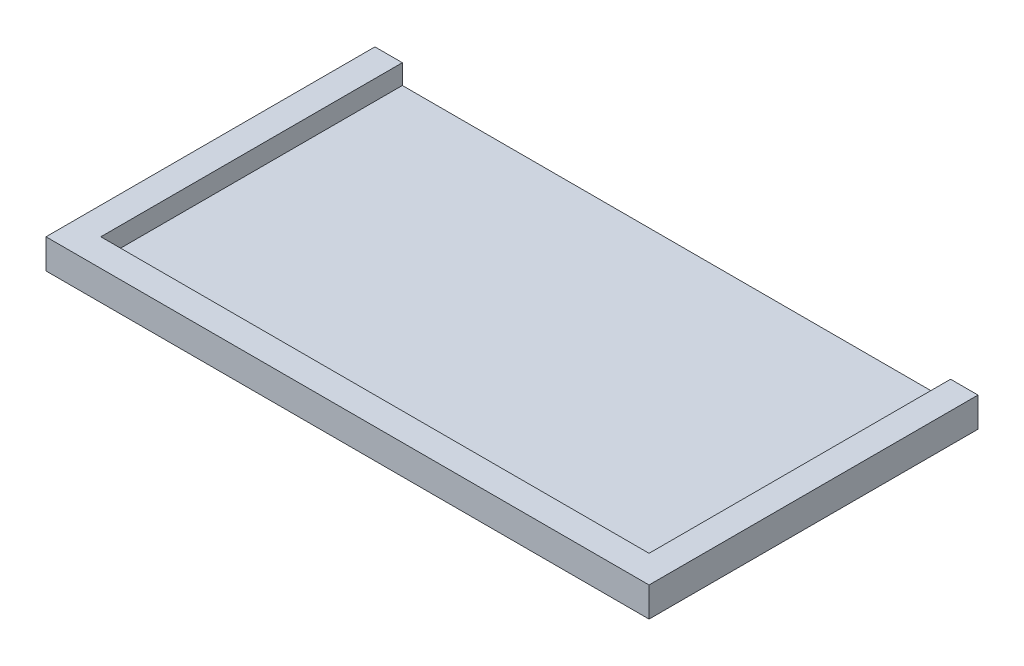
ISO-10303-21;
HEADER;
FILE_DESCRIPTION(('STEP AP214'),'2;1');
FILE_NAME('part.step','',(''),(''),'','','');
FILE_SCHEMA(('AUTOMOTIVE_DESIGN { 1 0 10303 214 1 1 1 1 }'));
ENDSEC;
DATA;
#1=APPLICATION_CONTEXT('core data for automotive mechanical design processes');
#2=APPLICATION_PROTOCOL_DEFINITION('international standard','automotive_design',2000,#1);
#3=PRODUCT_CONTEXT('',#1,'mechanical');
#4=PRODUCT('Part','Part','',(#3));
#5=PRODUCT_RELATED_PRODUCT_CATEGORY('part','',(#4));
#6=PRODUCT_DEFINITION_FORMATION('','',#4);
#7=PRODUCT_DEFINITION_CONTEXT('part definition',#1,'design');
#8=PRODUCT_DEFINITION('design','',#6,#7);
#9=PRODUCT_DEFINITION_SHAPE('','',#8);
#10=(LENGTH_UNIT() NAMED_UNIT(*) SI_UNIT(.MILLI.,.METRE.));
#11=(NAMED_UNIT(*) PLANE_ANGLE_UNIT() SI_UNIT($,.RADIAN.));
#12=(NAMED_UNIT(*) SI_UNIT($,.STERADIAN.) SOLID_ANGLE_UNIT());
#13=UNCERTAINTY_MEASURE_WITH_UNIT(LENGTH_MEASURE(1.E-05),#10,'distance_accuracy_value','');
#14=(GEOMETRIC_REPRESENTATION_CONTEXT(3) GLOBAL_UNCERTAINTY_ASSIGNED_CONTEXT((#13)) GLOBAL_UNIT_ASSIGNED_CONTEXT((#10,
#11,#12)) REPRESENTATION_CONTEXT('',''));
#15=CARTESIAN_POINT('',(0.,0.,0.));
#16=DIRECTION('',(0.,0.,1.));
#17=DIRECTION('',(1.,0.,0.));
#18=AXIS2_PLACEMENT_3D('',#15,#16,#17);
#19=CARTESIAN_POINT('',(0.,0.9,0.));
#20=DIRECTION('',(0.,-1.,0.));
#21=DIRECTION('',(0.,0.,-1.));
#22=AXIS2_PLACEMENT_3D('',#19,#20,#21);
#23=PLANE('',#22);
#24=DIRECTION('',(0.,0.,-1.));
#25=VECTOR('',#24,1.);
#26=CARTESIAN_POINT('',(-25.,0.9,-15.));
#27=LINE('',#26,#25);
#28=CARTESIAN_POINT('',(-25.,0.9,12.5));
#29=VERTEX_POINT('',#28);
#30=CARTESIAN_POINT('',(-25.,0.9,-15.));
#31=VERTEX_POINT('',#30);
#32=EDGE_CURVE('E48',#29,#31,#27,.T.);
#33=ORIENTED_EDGE('',*,*,#32,.F.);
#34=DIRECTION('',(-1.,0.,0.));
#35=VECTOR('',#34,1.);
#36=CARTESIAN_POINT('',(-25.,0.9,12.5));
#37=LINE('',#36,#35);
#38=CARTESIAN_POINT('',(25.,0.9,12.5));
#39=VERTEX_POINT('',#38);
#40=EDGE_CURVE('E121',#39,#29,#37,.T.);
#41=ORIENTED_EDGE('',*,*,#40,.F.);
#42=DIRECTION('',(0.,0.,1.));
#43=VECTOR('',#42,1.);
#44=CARTESIAN_POINT('',(25.,0.9,12.5));
#45=LINE('',#44,#43);
#46=CARTESIAN_POINT('',(25.,0.9,-15.));
#47=VERTEX_POINT('',#46);
#48=EDGE_CURVE('E135',#47,#39,#45,.T.);
#49=ORIENTED_EDGE('',*,*,#48,.F.);
#50=DIRECTION('',(-1.,0.,0.));
#51=VECTOR('',#50,1.);
#52=CARTESIAN_POINT('',(-27.5,0.9,-15.));
#53=LINE('',#52,#51);
#54=EDGE_CURVE('E53',#47,#31,#53,.T.);
#55=ORIENTED_EDGE('',*,*,#54,.T.);
#56=EDGE_LOOP('',(#33,#41,#49,#55));
#57=FACE_BOUND('',#56,.T.);
#58=ADVANCED_FACE('F33',(#57),#23,.F.);
#59=CARTESIAN_POINT('',(27.5,0.9,15.));
#60=DIRECTION('',(-1.,0.,0.));
#61=DIRECTION('',(0.,0.,1.));
#62=AXIS2_PLACEMENT_3D('',#59,#60,#61);
#63=PLANE('',#62);
#64=DIRECTION('',(0.,0.,-1.));
#65=VECTOR('',#64,1.);
#66=CARTESIAN_POINT('',(27.5,0.,15.));
#67=LINE('',#66,#65);
#68=CARTESIAN_POINT('',(27.5,0.,15.));
#69=VERTEX_POINT('',#68);
#70=CARTESIAN_POINT('',(27.5,0.,-15.));
#71=VERTEX_POINT('',#70);
#72=EDGE_CURVE('E150',#69,#71,#67,.T.);
#73=ORIENTED_EDGE('',*,*,#72,.T.);
#74=DIRECTION('',(0.,-1.,0.));
#75=VECTOR('',#74,1.);
#76=CARTESIAN_POINT('',(27.5,0.9,-15.));
#77=LINE('',#76,#75);
#78=CARTESIAN_POINT('',(27.5,2.7,-15.));
#79=VERTEX_POINT('',#78);
#80=EDGE_CURVE('E11',#79,#71,#77,.T.);
#81=ORIENTED_EDGE('',*,*,#80,.F.);
#82=DIRECTION('',(0.,0.,-1.));
#83=VECTOR('',#82,1.);
#84=CARTESIAN_POINT('',(27.5,2.7,15.));
#85=LINE('',#84,#83);
#86=CARTESIAN_POINT('',(27.5,2.7,15.));
#87=VERTEX_POINT('',#86);
#88=EDGE_CURVE('E110',#87,#79,#85,.T.);
#89=ORIENTED_EDGE('',*,*,#88,.F.);
#90=DIRECTION('',(0.,-1.,0.));
#91=VECTOR('',#90,1.);
#92=CARTESIAN_POINT('',(27.5,0.9,15.));
#93=LINE('',#92,#91);
#94=EDGE_CURVE('E96',#87,#69,#93,.T.);
#95=ORIENTED_EDGE('',*,*,#94,.T.);
#96=EDGE_LOOP('',(#73,#81,#89,#95));
#97=FACE_BOUND('',#96,.T.);
#98=ADVANCED_FACE('F35',(#97),#63,.F.);
#99=CARTESIAN_POINT('',(-27.5,0.9,-15.));
#100=DIRECTION('',(0.,0.,1.));
#101=DIRECTION('',(1.,0.,0.));
#102=AXIS2_PLACEMENT_3D('',#99,#100,#101);
#103=PLANE('',#102);
#104=DIRECTION('',(-1.,0.,0.));
#105=VECTOR('',#104,1.);
#106=CARTESIAN_POINT('',(-27.5,0.,-15.));
#107=LINE('',#106,#105);
#108=CARTESIAN_POINT('',(-27.5,0.,-15.));
#109=VERTEX_POINT('',#108);
#110=EDGE_CURVE('E153',#71,#109,#107,.T.);
#111=ORIENTED_EDGE('',*,*,#110,.T.);
#112=DIRECTION('',(0.,-1.,0.));
#113=VECTOR('',#112,1.);
#114=CARTESIAN_POINT('',(-27.5,0.9,-15.));
#115=LINE('',#114,#113);
#116=CARTESIAN_POINT('',(-27.5,2.7,-15.));
#117=VERTEX_POINT('',#116);
#118=EDGE_CURVE('E41',#117,#109,#115,.T.);
#119=ORIENTED_EDGE('',*,*,#118,.F.);
#120=DIRECTION('',(-1.,0.,0.));
#121=VECTOR('',#120,1.);
#122=CARTESIAN_POINT('',(-27.5,2.7,-15.));
#123=LINE('',#122,#121);
#124=CARTESIAN_POINT('',(-25.,2.7,-15.));
#125=VERTEX_POINT('',#124);
#126=EDGE_CURVE('E131',#125,#117,#123,.T.);
#127=ORIENTED_EDGE('',*,*,#126,.F.);
#128=DIRECTION('',(0.,-1.,0.));
#129=VECTOR('',#128,1.);
#130=CARTESIAN_POINT('',(-25.,2.7,-15.));
#131=LINE('',#130,#129);
#132=EDGE_CURVE('E134',#125,#31,#131,.T.);
#133=ORIENTED_EDGE('',*,*,#132,.T.);
#134=ORIENTED_EDGE('',*,*,#54,.F.);
#135=DIRECTION('',(0.,-1.,0.));
#136=VECTOR('',#135,1.);
#137=CARTESIAN_POINT('',(25.,2.7,-15.));
#138=LINE('',#137,#136);
#139=CARTESIAN_POINT('',(25.,2.7,-15.));
#140=VERTEX_POINT('',#139);
#141=EDGE_CURVE('E147',#140,#47,#138,.T.);
#142=ORIENTED_EDGE('',*,*,#141,.F.);
#143=DIRECTION('',(-1.,0.,0.));
#144=VECTOR('',#143,1.);
#145=CARTESIAN_POINT('',(25.,2.7,-15.));
#146=LINE('',#145,#144);
#147=EDGE_CURVE('E113',#79,#140,#146,.T.);
#148=ORIENTED_EDGE('',*,*,#147,.F.);
#149=ORIENTED_EDGE('',*,*,#80,.T.);
#150=EDGE_LOOP('',(#111,#119,#127,#133,#134,#142,#148,#149));
#151=FACE_BOUND('',#150,.T.);
#152=ADVANCED_FACE('F166',(#151),#103,.F.);
#153=CARTESIAN_POINT('',(-27.5,0.9,15.));
#154=DIRECTION('',(1.,0.,0.));
#155=DIRECTION('',(0.,0.,-1.));
#156=AXIS2_PLACEMENT_3D('',#153,#154,#155);
#157=PLANE('',#156);
#158=DIRECTION('',(0.,0.,1.));
#159=VECTOR('',#158,1.);
#160=CARTESIAN_POINT('',(-27.5,0.,15.));
#161=LINE('',#160,#159);
#162=CARTESIAN_POINT('',(-27.5,0.,15.));
#163=VERTEX_POINT('',#162);
#164=EDGE_CURVE('E155',#109,#163,#161,.T.);
#165=ORIENTED_EDGE('',*,*,#164,.T.);
#166=DIRECTION('',(0.,-1.,0.));
#167=VECTOR('',#166,1.);
#168=CARTESIAN_POINT('',(-27.5,0.9,15.));
#169=LINE('',#168,#167);
#170=CARTESIAN_POINT('',(-27.5,2.7,15.));
#171=VERTEX_POINT('',#170);
#172=EDGE_CURVE('E107',#171,#163,#169,.T.);
#173=ORIENTED_EDGE('',*,*,#172,.F.);
#174=DIRECTION('',(0.,0.,1.));
#175=VECTOR('',#174,1.);
#176=CARTESIAN_POINT('',(-27.5,2.7,-15.));
#177=LINE('',#176,#175);
#178=EDGE_CURVE('E119',#117,#171,#177,.T.);
#179=ORIENTED_EDGE('',*,*,#178,.F.);
#180=ORIENTED_EDGE('',*,*,#118,.T.);
#181=EDGE_LOOP('',(#165,#173,#179,#180));
#182=FACE_BOUND('',#181,.T.);
#183=ADVANCED_FACE('F161',(#182),#157,.F.);
#184=CARTESIAN_POINT('',(-27.5,0.9,15.));
#185=DIRECTION('',(0.,0.,-1.));
#186=DIRECTION('',(-1.,0.,0.));
#187=AXIS2_PLACEMENT_3D('',#184,#185,#186);
#188=PLANE('',#187);
#189=DIRECTION('',(1.,0.,0.));
#190=VECTOR('',#189,1.);
#191=CARTESIAN_POINT('',(-27.5,0.,15.));
#192=LINE('',#191,#190);
#193=EDGE_CURVE('E103',#163,#69,#192,.T.);
#194=ORIENTED_EDGE('',*,*,#193,.T.);
#195=ORIENTED_EDGE('',*,*,#94,.F.);
#196=DIRECTION('',(1.,0.,0.));
#197=VECTOR('',#196,1.);
#198=CARTESIAN_POINT('',(-27.5,2.7,15.));
#199=LINE('',#198,#197);
#200=EDGE_CURVE('E101',#171,#87,#199,.T.);
#201=ORIENTED_EDGE('',*,*,#200,.F.);
#202=ORIENTED_EDGE('',*,*,#172,.T.);
#203=EDGE_LOOP('',(#194,#195,#201,#202));
#204=FACE_BOUND('',#203,.T.);
#205=ADVANCED_FACE('F98',(#204),#188,.F.);
#206=CARTESIAN_POINT('',(0.,0.,0.));
#207=DIRECTION('',(0.,-1.,0.));
#208=DIRECTION('',(0.,0.,-1.));
#209=AXIS2_PLACEMENT_3D('',#206,#207,#208);
#210=PLANE('',#209);
#211=ORIENTED_EDGE('',*,*,#72,.F.);
#212=ORIENTED_EDGE('',*,*,#193,.F.);
#213=ORIENTED_EDGE('',*,*,#164,.F.);
#214=ORIENTED_EDGE('',*,*,#110,.F.);
#215=EDGE_LOOP('',(#211,#212,#213,#214));
#216=FACE_BOUND('',#215,.T.);
#217=ADVANCED_FACE('F165',(#216),#210,.T.);
#218=CARTESIAN_POINT('',(25.,2.7,12.5));
#219=DIRECTION('',(1.,0.,0.));
#220=DIRECTION('',(0.,0.,-1.));
#221=AXIS2_PLACEMENT_3D('',#218,#219,#220);
#222=PLANE('',#221);
#223=ORIENTED_EDGE('',*,*,#48,.T.);
#224=DIRECTION('',(0.,-1.,0.));
#225=VECTOR('',#224,1.);
#226=CARTESIAN_POINT('',(25.,2.7,12.5));
#227=LINE('',#226,#225);
#228=CARTESIAN_POINT('',(25.,2.7,12.5));
#229=VERTEX_POINT('',#228);
#230=EDGE_CURVE('E144',#229,#39,#227,.T.);
#231=ORIENTED_EDGE('',*,*,#230,.F.);
#232=DIRECTION('',(0.,0.,1.));
#233=VECTOR('',#232,1.);
#234=CARTESIAN_POINT('',(25.,2.7,12.5));
#235=LINE('',#234,#233);
#236=EDGE_CURVE('E125',#140,#229,#235,.T.);
#237=ORIENTED_EDGE('',*,*,#236,.F.);
#238=ORIENTED_EDGE('',*,*,#141,.T.);
#239=EDGE_LOOP('',(#223,#231,#237,#238));
#240=FACE_BOUND('',#239,.T.);
#241=ADVANCED_FACE('F173',(#240),#222,.F.);
#242=CARTESIAN_POINT('',(-25.,2.7,12.5));
#243=DIRECTION('',(0.,0.,1.));
#244=DIRECTION('',(1.,0.,0.));
#245=AXIS2_PLACEMENT_3D('',#242,#243,#244);
#246=PLANE('',#245);
#247=ORIENTED_EDGE('',*,*,#40,.T.);
#248=DIRECTION('',(0.,-1.,0.));
#249=VECTOR('',#248,1.);
#250=CARTESIAN_POINT('',(-25.,2.7,12.5));
#251=LINE('',#250,#249);
#252=CARTESIAN_POINT('',(-25.,2.7,12.5));
#253=VERTEX_POINT('',#252);
#254=EDGE_CURVE('E141',#253,#29,#251,.T.);
#255=ORIENTED_EDGE('',*,*,#254,.F.);
#256=DIRECTION('',(-1.,0.,0.));
#257=VECTOR('',#256,1.);
#258=CARTESIAN_POINT('',(-25.,2.7,12.5));
#259=LINE('',#258,#257);
#260=EDGE_CURVE('E127',#229,#253,#259,.T.);
#261=ORIENTED_EDGE('',*,*,#260,.F.);
#262=ORIENTED_EDGE('',*,*,#230,.T.);
#263=EDGE_LOOP('',(#247,#255,#261,#262));
#264=FACE_BOUND('',#263,.T.);
#265=ADVANCED_FACE('F175',(#264),#246,.F.);
#266=CARTESIAN_POINT('',(-25.,2.7,-15.));
#267=DIRECTION('',(-1.,0.,0.));
#268=DIRECTION('',(0.,0.,1.));
#269=AXIS2_PLACEMENT_3D('',#266,#267,#268);
#270=PLANE('',#269);
#271=ORIENTED_EDGE('',*,*,#32,.T.);
#272=ORIENTED_EDGE('',*,*,#132,.F.);
#273=DIRECTION('',(0.,0.,-1.));
#274=VECTOR('',#273,1.);
#275=CARTESIAN_POINT('',(-25.,2.7,-15.));
#276=LINE('',#275,#274);
#277=EDGE_CURVE('E129',#253,#125,#276,.T.);
#278=ORIENTED_EDGE('',*,*,#277,.F.);
#279=ORIENTED_EDGE('',*,*,#254,.T.);
#280=EDGE_LOOP('',(#271,#272,#278,#279));
#281=FACE_BOUND('',#280,.T.);
#282=ADVANCED_FACE('F179',(#281),#270,.F.);
#283=CARTESIAN_POINT('',(0.,2.7,0.));
#284=DIRECTION('',(0.,1.,0.));
#285=DIRECTION('',(0.,0.,1.));
#286=AXIS2_PLACEMENT_3D('',#283,#284,#285);
#287=PLANE('',#286);
#288=ORIENTED_EDGE('',*,*,#200,.T.);
#289=ORIENTED_EDGE('',*,*,#88,.T.);
#290=ORIENTED_EDGE('',*,*,#147,.T.);
#291=ORIENTED_EDGE('',*,*,#236,.T.);
#292=ORIENTED_EDGE('',*,*,#260,.T.);
#293=ORIENTED_EDGE('',*,*,#277,.T.);
#294=ORIENTED_EDGE('',*,*,#126,.T.);
#295=ORIENTED_EDGE('',*,*,#178,.T.);
#296=EDGE_LOOP('',(#288,#289,#290,#291,#292,#293,#294,#295));
#297=FACE_BOUND('',#296,.T.);
#298=ADVANCED_FACE('F116',(#297),#287,.T.);
#299=CLOSED_SHELL('',(#58,#98,#152,#183,#205,#217,#241,#265,#282,#298));
#300=MANIFOLD_SOLID_BREP('B2',#299);
#301=ADVANCED_BREP_SHAPE_REPRESENTATION('',(#18,#300),#14);
#302=SHAPE_DEFINITION_REPRESENTATION(#9,#301);
ENDSEC;
END-ISO-10303-21;
